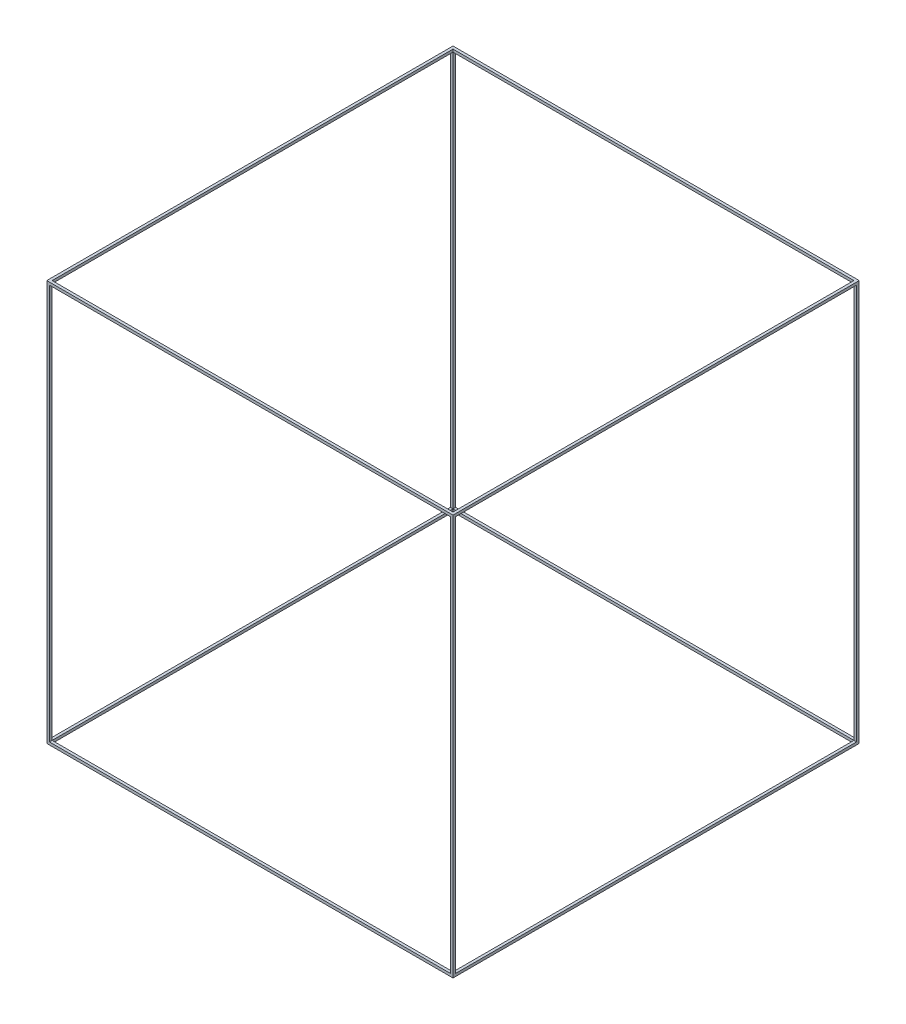
ISO-10303-21;
HEADER;
FILE_DESCRIPTION(('STEP AP214'),'2;1');
FILE_NAME('part.step','',(''),(''),'','','');
FILE_SCHEMA(('AUTOMOTIVE_DESIGN { 1 0 10303 214 1 1 1 1 }'));
ENDSEC;
DATA;
#1=APPLICATION_CONTEXT('core data for automotive mechanical design processes');
#2=APPLICATION_PROTOCOL_DEFINITION('international standard','automotive_design',2000,#1);
#3=PRODUCT_CONTEXT('',#1,'mechanical');
#4=PRODUCT('Part','Part','',(#3));
#5=PRODUCT_RELATED_PRODUCT_CATEGORY('part','',(#4));
#6=PRODUCT_DEFINITION_FORMATION('','',#4);
#7=PRODUCT_DEFINITION_CONTEXT('part definition',#1,'design');
#8=PRODUCT_DEFINITION('design','',#6,#7);
#9=PRODUCT_DEFINITION_SHAPE('','',#8);
#10=(LENGTH_UNIT() NAMED_UNIT(*) SI_UNIT(.MILLI.,.METRE.));
#11=(NAMED_UNIT(*) PLANE_ANGLE_UNIT() SI_UNIT($,.RADIAN.));
#12=(NAMED_UNIT(*) SI_UNIT($,.STERADIAN.) SOLID_ANGLE_UNIT());
#13=UNCERTAINTY_MEASURE_WITH_UNIT(LENGTH_MEASURE(1.E-05),#10,'distance_accuracy_value','');
#14=(GEOMETRIC_REPRESENTATION_CONTEXT(3) GLOBAL_UNCERTAINTY_ASSIGNED_CONTEXT((#13)) GLOBAL_UNIT_ASSIGNED_CONTEXT((#10,
#11,#12)) REPRESENTATION_CONTEXT('',''));
#15=CARTESIAN_POINT('',(0.,0.,0.));
#16=DIRECTION('',(0.,0.,1.));
#17=DIRECTION('',(1.,0.,0.));
#18=AXIS2_PLACEMENT_3D('',#15,#16,#17);
#19=CARTESIAN_POINT('',(-75.,149.,-75.));
#20=DIRECTION('',(1.,0.,0.));
#21=DIRECTION('',(0.,0.,-1.));
#22=AXIS2_PLACEMENT_3D('',#19,#20,#21);
#23=PLANE('',#22);
#24=DIRECTION('',(0.,1.,0.));
#25=VECTOR('',#24,1.);
#26=CARTESIAN_POINT('',(-75.,149.,-75.));
#27=LINE('',#26,#25);
#28=CARTESIAN_POINT('',(-75.,1.,-75.));
#29=VERTEX_POINT('',#28);
#30=CARTESIAN_POINT('',(-75.,149.,-75.));
#31=VERTEX_POINT('',#30);
#32=EDGE_CURVE('E231',#29,#31,#27,.T.);
#33=ORIENTED_EDGE('',*,*,#32,.F.);
#34=DIRECTION('',(0.,0.,1.));
#35=VECTOR('',#34,1.);
#36=CARTESIAN_POINT('',(-75.,1.,-76.));
#37=LINE('',#36,#35);
#38=CARTESIAN_POINT('',(-75.,1.,-76.));
#39=VERTEX_POINT('',#38);
#40=EDGE_CURVE('E276',#39,#29,#37,.T.);
#41=ORIENTED_EDGE('',*,*,#40,.F.);
#42=DIRECTION('',(0.,-1.,0.));
#43=VECTOR('',#42,1.);
#44=CARTESIAN_POINT('',(-75.,149.,-76.));
#45=LINE('',#44,#43);
#46=CARTESIAN_POINT('',(-75.,149.,-76.));
#47=VERTEX_POINT('',#46);
#48=EDGE_CURVE('E240',#47,#39,#45,.T.);
#49=ORIENTED_EDGE('',*,*,#48,.F.);
#50=DIRECTION('',(0.,0.,1.));
#51=VECTOR('',#50,1.);
#52=CARTESIAN_POINT('',(-75.,149.,-76.));
#53=LINE('',#52,#51);
#54=EDGE_CURVE('E263',#47,#31,#53,.T.);
#55=ORIENTED_EDGE('',*,*,#54,.T.);
#56=EDGE_LOOP('',(#33,#41,#49,#55));
#57=FACE_BOUND('',#56,.T.);
#58=ADVANCED_FACE('F41',(#57),#23,.T.);
#59=DIRECTION('',(0.,0.,1.));
#60=VECTOR('',#59,1.);
#61=CARTESIAN_POINT('',(-75.,149.,-75.));
#62=LINE('',#61,#60);
#63=CARTESIAN_POINT('',(-75.,149.,75.));
#64=VERTEX_POINT('',#63);
#65=EDGE_CURVE('E237',#31,#64,#62,.T.);
#66=ORIENTED_EDGE('',*,*,#65,.F.);
#67=DIRECTION('',(0.,-1.,0.));
#68=VECTOR('',#67,1.);
#69=CARTESIAN_POINT('',(-75.,149.,-75.));
#70=LINE('',#69,#68);
#71=CARTESIAN_POINT('',(-75.,150.,-75.));
#72=VERTEX_POINT('',#71);
#73=EDGE_CURVE('E309',#72,#31,#70,.T.);
#74=ORIENTED_EDGE('',*,*,#73,.F.);
#75=DIRECTION('',(0.,0.,1.));
#76=VECTOR('',#75,1.);
#77=CARTESIAN_POINT('',(-75.,150.,-75.));
#78=LINE('',#77,#76);
#79=CARTESIAN_POINT('',(-75.,150.,75.));
#80=VERTEX_POINT('',#79);
#81=EDGE_CURVE('E284',#72,#80,#78,.T.);
#82=ORIENTED_EDGE('',*,*,#81,.T.);
#83=DIRECTION('',(0.,-1.,0.));
#84=VECTOR('',#83,1.);
#85=CARTESIAN_POINT('',(-75.,149.,75.));
#86=LINE('',#85,#84);
#87=EDGE_CURVE('E321',#80,#64,#86,.T.);
#88=ORIENTED_EDGE('',*,*,#87,.T.);
#89=EDGE_LOOP('',(#66,#74,#82,#88));
#90=FACE_BOUND('',#89,.T.);
#91=ADVANCED_FACE('F370',(#90),#23,.T.);
#92=DIRECTION('',(0.,-1.,0.));
#93=VECTOR('',#92,1.);
#94=CARTESIAN_POINT('',(-75.,149.,75.0000000000001));
#95=LINE('',#94,#93);
#96=CARTESIAN_POINT('',(-75.,1.,75.));
#97=VERTEX_POINT('',#96);
#98=EDGE_CURVE('E227',#64,#97,#95,.T.);
#99=ORIENTED_EDGE('',*,*,#98,.F.);
#100=CARTESIAN_POINT('',(-75.,149.,76.));
#101=VERTEX_POINT('',#100);
#102=EDGE_CURVE('E267',#64,#101,#53,.T.);
#103=ORIENTED_EDGE('',*,*,#102,.T.);
#104=DIRECTION('',(0.,-1.,0.));
#105=VECTOR('',#104,1.);
#106=CARTESIAN_POINT('',(-75.,149.,76.));
#107=LINE('',#106,#105);
#108=CARTESIAN_POINT('',(-75.,1.,76.));
#109=VERTEX_POINT('',#108);
#110=EDGE_CURVE('E239',#101,#109,#107,.T.);
#111=ORIENTED_EDGE('',*,*,#110,.T.);
#112=EDGE_CURVE('E253',#97,#109,#37,.T.);
#113=ORIENTED_EDGE('',*,*,#112,.F.);
#114=EDGE_LOOP('',(#99,#103,#111,#113));
#115=FACE_BOUND('',#114,.T.);
#116=ADVANCED_FACE('F385',(#115),#23,.T.);
#117=CARTESIAN_POINT('',(75.,149.,-75.));
#118=DIRECTION('',(-1.,0.,0.));
#119=DIRECTION('',(0.,0.,1.));
#120=AXIS2_PLACEMENT_3D('',#117,#118,#119);
#121=PLANE('',#120);
#122=DIRECTION('',(0.,-1.,0.));
#123=VECTOR('',#122,1.);
#124=CARTESIAN_POINT('',(75.,149.,-75.));
#125=LINE('',#124,#123);
#126=CARTESIAN_POINT('',(75.,149.,-75.));
#127=VERTEX_POINT('',#126);
#128=CARTESIAN_POINT('',(75.,1.,-75.));
#129=VERTEX_POINT('',#128);
#130=EDGE_CURVE('E187',#127,#129,#125,.T.);
#131=ORIENTED_EDGE('',*,*,#130,.F.);
#132=DIRECTION('',(0.,0.,1.));
#133=VECTOR('',#132,1.);
#134=CARTESIAN_POINT('',(75.,149.,-76.));
#135=LINE('',#134,#133);
#136=CARTESIAN_POINT('',(75.,149.,-76.));
#137=VERTEX_POINT('',#136);
#138=EDGE_CURVE('E268',#137,#127,#135,.T.);
#139=ORIENTED_EDGE('',*,*,#138,.F.);
#140=DIRECTION('',(0.,1.,0.));
#141=VECTOR('',#140,1.);
#142=CARTESIAN_POINT('',(75.,149.,-76.));
#143=LINE('',#142,#141);
#144=CARTESIAN_POINT('',(75.,1.,-76.));
#145=VERTEX_POINT('',#144);
#146=EDGE_CURVE('E247',#145,#137,#143,.T.);
#147=ORIENTED_EDGE('',*,*,#146,.F.);
#148=DIRECTION('',(0.,0.,1.));
#149=VECTOR('',#148,1.);
#150=CARTESIAN_POINT('',(75.,1.,-76.));
#151=LINE('',#150,#149);
#152=EDGE_CURVE('E272',#145,#129,#151,.T.);
#153=ORIENTED_EDGE('',*,*,#152,.T.);
#154=EDGE_LOOP('',(#131,#139,#147,#153));
#155=FACE_BOUND('',#154,.T.);
#156=ADVANCED_FACE('F403',(#155),#121,.T.);
#157=DIRECTION('',(0.,0.,-1.));
#158=VECTOR('',#157,1.);
#159=CARTESIAN_POINT('',(75.,149.,-75.));
#160=LINE('',#159,#158);
#161=CARTESIAN_POINT('',(75.,149.,75.));
#162=VERTEX_POINT('',#161);
#163=EDGE_CURVE('E11',#162,#127,#160,.T.);
#164=ORIENTED_EDGE('',*,*,#163,.F.);
#165=DIRECTION('',(0.,-1.,0.));
#166=VECTOR('',#165,1.);
#167=CARTESIAN_POINT('',(75.,149.,75.));
#168=LINE('',#167,#166);
#169=CARTESIAN_POINT('',(75.,150.,75.));
#170=VERTEX_POINT('',#169);
#171=EDGE_CURVE('E317',#170,#162,#168,.T.);
#172=ORIENTED_EDGE('',*,*,#171,.F.);
#173=DIRECTION('',(0.,0.,-1.));
#174=VECTOR('',#173,1.);
#175=CARTESIAN_POINT('',(75.,150.,-75.));
#176=LINE('',#175,#174);
#177=CARTESIAN_POINT('',(75.,150.,-75.));
#178=VERTEX_POINT('',#177);
#179=EDGE_CURVE('E290',#170,#178,#176,.T.);
#180=ORIENTED_EDGE('',*,*,#179,.T.);
#181=DIRECTION('',(0.,-1.,0.));
#182=VECTOR('',#181,1.);
#183=CARTESIAN_POINT('',(75.,149.,-75.));
#184=LINE('',#183,#182);
#185=EDGE_CURVE('E313',#178,#127,#184,.T.);
#186=ORIENTED_EDGE('',*,*,#185,.T.);
#187=EDGE_LOOP('',(#164,#172,#180,#186));
#188=FACE_BOUND('',#187,.T.);
#189=ADVANCED_FACE('F399',(#188),#121,.T.);
#190=DIRECTION('',(0.,1.,0.));
#191=VECTOR('',#190,1.);
#192=CARTESIAN_POINT('',(75.,149.,75.));
#193=LINE('',#192,#191);
#194=CARTESIAN_POINT('',(75.,1.,75.));
#195=VERTEX_POINT('',#194);
#196=EDGE_CURVE('E219',#195,#162,#193,.T.);
#197=ORIENTED_EDGE('',*,*,#196,.F.);
#198=CARTESIAN_POINT('',(75.,1.,76.));
#199=VERTEX_POINT('',#198);
#200=EDGE_CURVE('E275',#195,#199,#151,.T.);
#201=ORIENTED_EDGE('',*,*,#200,.T.);
#202=DIRECTION('',(0.,1.,0.));
#203=VECTOR('',#202,1.);
#204=CARTESIAN_POINT('',(75.,149.,76.));
#205=LINE('',#204,#203);
#206=CARTESIAN_POINT('',(75.,149.,76.));
#207=VERTEX_POINT('',#206);
#208=EDGE_CURVE('E258',#199,#207,#205,.T.);
#209=ORIENTED_EDGE('',*,*,#208,.T.);
#210=EDGE_CURVE('E271',#162,#207,#135,.T.);
#211=ORIENTED_EDGE('',*,*,#210,.F.);
#212=EDGE_LOOP('',(#197,#201,#209,#211));
#213=FACE_BOUND('',#212,.T.);
#214=ADVANCED_FACE('F473',(#213),#121,.T.);
#215=CARTESIAN_POINT('',(-75.,149.,75.));
#216=DIRECTION('',(0.,0.,-1.));
#217=DIRECTION('',(-1.,0.,0.));
#218=AXIS2_PLACEMENT_3D('',#215,#216,#217);
#219=PLANE('',#218);
#220=DIRECTION('',(1.,0.,0.));
#221=VECTOR('',#220,1.);
#222=CARTESIAN_POINT('',(-75.,149.,75.));
#223=LINE('',#222,#221);
#224=EDGE_CURVE('E281',#64,#162,#223,.T.);
#225=ORIENTED_EDGE('',*,*,#224,.F.);
#226=ORIENTED_EDGE('',*,*,#87,.F.);
#227=DIRECTION('',(1.,0.,0.));
#228=VECTOR('',#227,1.);
#229=CARTESIAN_POINT('',(-75.,150.,75.));
#230=LINE('',#229,#228);
#231=EDGE_CURVE('E287',#80,#170,#230,.T.);
#232=ORIENTED_EDGE('',*,*,#231,.T.);
#233=ORIENTED_EDGE('',*,*,#171,.T.);
#234=EDGE_LOOP('',(#225,#226,#232,#233));
#235=FACE_BOUND('',#234,.T.);
#236=ADVANCED_FACE('F395',(#235),#219,.T.);
#237=CARTESIAN_POINT('',(-75.,149.,-75.));
#238=DIRECTION('',(0.,0.,1.));
#239=DIRECTION('',(1.,0.,0.));
#240=AXIS2_PLACEMENT_3D('',#237,#238,#239);
#241=PLANE('',#240);
#242=DIRECTION('',(-1.,0.,0.));
#243=VECTOR('',#242,1.);
#244=CARTESIAN_POINT('',(-75.,149.,-75.));
#245=LINE('',#244,#243);
#246=EDGE_CURVE('E49',#127,#31,#245,.T.);
#247=ORIENTED_EDGE('',*,*,#246,.F.);
#248=ORIENTED_EDGE('',*,*,#185,.F.);
#249=DIRECTION('',(-1.,0.,0.));
#250=VECTOR('',#249,1.);
#251=CARTESIAN_POINT('',(-75.,150.,-75.));
#252=LINE('',#251,#250);
#253=EDGE_CURVE('E293',#178,#72,#252,.T.);
#254=ORIENTED_EDGE('',*,*,#253,.T.);
#255=ORIENTED_EDGE('',*,*,#73,.T.);
#256=EDGE_LOOP('',(#247,#248,#254,#255));
#257=FACE_BOUND('',#256,.T.);
#258=ADVANCED_FACE('F365',(#257),#241,.T.);
#259=CARTESIAN_POINT('',(-76.,150.,-75.));
#260=DIRECTION('',(1.,0.,0.));
#261=DIRECTION('',(0.,0.,-1.));
#262=AXIS2_PLACEMENT_3D('',#259,#260,#261);
#263=PLANE('',#262);
#264=DIRECTION('',(0.,0.,1.));
#265=VECTOR('',#264,1.);
#266=CARTESIAN_POINT('',(-76.,1.,-75.));
#267=LINE('',#266,#265);
#268=CARTESIAN_POINT('',(-76.,1.,-75.));
#269=VERTEX_POINT('',#268);
#270=CARTESIAN_POINT('',(-76.,1.,75.));
#271=VERTEX_POINT('',#270);
#272=EDGE_CURVE('E212',#269,#271,#267,.T.);
#273=ORIENTED_EDGE('',*,*,#272,.F.);
#274=DIRECTION('',(0.,-1.,0.));
#275=VECTOR('',#274,1.);
#276=CARTESIAN_POINT('',(-76.,149.,-75.));
#277=LINE('',#276,#275);
#278=CARTESIAN_POINT('',(-76.,149.,-75.));
#279=VERTEX_POINT('',#278);
#280=EDGE_CURVE('E56',#279,#269,#277,.T.);
#281=ORIENTED_EDGE('',*,*,#280,.F.);
#282=DIRECTION('',(0.,0.,-1.));
#283=VECTOR('',#282,1.);
#284=CARTESIAN_POINT('',(-76.,149.,-75.));
#285=LINE('',#284,#283);
#286=CARTESIAN_POINT('',(-76.,149.,75.));
#287=VERTEX_POINT('',#286);
#288=EDGE_CURVE('E203',#287,#279,#285,.T.);
#289=ORIENTED_EDGE('',*,*,#288,.F.);
#290=DIRECTION('',(0.,1.,0.));
#291=VECTOR('',#290,1.);
#292=CARTESIAN_POINT('',(-76.,149.,75.));
#293=LINE('',#292,#291);
#294=EDGE_CURVE('E206',#271,#287,#293,.T.);
#295=ORIENTED_EDGE('',*,*,#294,.F.);
#296=EDGE_LOOP('',(#273,#281,#289,#295));
#297=FACE_BOUND('',#296,.T.);
#298=DIRECTION('',(0.,0.,1.));
#299=VECTOR('',#298,1.);
#300=CARTESIAN_POINT('',(-76.,0.,-75.));
#301=LINE('',#300,#299);
#302=CARTESIAN_POINT('',(-76.,0.,-76.));
#303=VERTEX_POINT('',#302);
#304=CARTESIAN_POINT('',(-76.,0.,76.));
#305=VERTEX_POINT('',#304);
#306=EDGE_CURVE('E324',#303,#305,#301,.T.);
#307=ORIENTED_EDGE('',*,*,#306,.T.);
#308=DIRECTION('',(0.,-1.,0.));
#309=VECTOR('',#308,1.);
#310=CARTESIAN_POINT('',(-76.,150.,76.));
#311=LINE('',#310,#309);
#312=CARTESIAN_POINT('',(-76.,150.,76.));
#313=VERTEX_POINT('',#312);
#314=EDGE_CURVE('E351',#313,#305,#311,.T.);
#315=ORIENTED_EDGE('',*,*,#314,.F.);
#316=DIRECTION('',(0.,0.,1.));
#317=VECTOR('',#316,1.);
#318=CARTESIAN_POINT('',(-76.,150.,-75.));
#319=LINE('',#318,#317);
#320=CARTESIAN_POINT('',(-76.,150.,-76.));
#321=VERTEX_POINT('',#320);
#322=EDGE_CURVE('E325',#321,#313,#319,.T.);
#323=ORIENTED_EDGE('',*,*,#322,.F.);
#324=DIRECTION('',(0.,-1.,0.));
#325=VECTOR('',#324,1.);
#326=CARTESIAN_POINT('',(-76.,150.,-76.));
#327=LINE('',#326,#325);
#328=EDGE_CURVE('E335',#321,#303,#327,.T.);
#329=ORIENTED_EDGE('',*,*,#328,.T.);
#330=EDGE_LOOP('',(#307,#315,#323,#329));
#331=FACE_BOUND('',#330,.T.);
#332=ADVANCED_FACE('F43',(#297,#331),#263,.F.);
#333=CARTESIAN_POINT('',(-75.,150.,76.));
#334=DIRECTION('',(0.,0.,-1.));
#335=DIRECTION('',(-1.,0.,0.));
#336=AXIS2_PLACEMENT_3D('',#333,#334,#335);
#337=PLANE('',#336);
#338=DIRECTION('',(1.,0.,0.));
#339=VECTOR('',#338,1.);
#340=CARTESIAN_POINT('',(-75.,1.,76.));
#341=LINE('',#340,#339);
#342=EDGE_CURVE('E255',#109,#199,#341,.T.);
#343=ORIENTED_EDGE('',*,*,#342,.F.);
#344=ORIENTED_EDGE('',*,*,#110,.F.);
#345=DIRECTION('',(-1.,0.,0.));
#346=VECTOR('',#345,1.);
#347=CARTESIAN_POINT('',(-75.,149.,76.));
#348=LINE('',#347,#346);
#349=EDGE_CURVE('E244',#207,#101,#348,.T.);
#350=ORIENTED_EDGE('',*,*,#349,.F.);
#351=ORIENTED_EDGE('',*,*,#208,.F.);
#352=EDGE_LOOP('',(#343,#344,#350,#351));
#353=FACE_BOUND('',#352,.T.);
#354=DIRECTION('',(1.,0.,0.));
#355=VECTOR('',#354,1.);
#356=CARTESIAN_POINT('',(-75.,0.,76.));
#357=LINE('',#356,#355);
#358=CARTESIAN_POINT('',(76.,0.,76.));
#359=VERTEX_POINT('',#358);
#360=EDGE_CURVE('E338',#305,#359,#357,.T.);
#361=ORIENTED_EDGE('',*,*,#360,.T.);
#362=DIRECTION('',(0.,-1.,0.));
#363=VECTOR('',#362,1.);
#364=CARTESIAN_POINT('',(76.,150.,76.));
#365=LINE('',#364,#363);
#366=CARTESIAN_POINT('',(76.,150.,76.));
#367=VERTEX_POINT('',#366);
#368=EDGE_CURVE('E348',#367,#359,#365,.T.);
#369=ORIENTED_EDGE('',*,*,#368,.F.);
#370=DIRECTION('',(1.,0.,0.));
#371=VECTOR('',#370,1.);
#372=CARTESIAN_POINT('',(-75.,150.,76.));
#373=LINE('',#372,#371);
#374=EDGE_CURVE('E328',#313,#367,#373,.T.);
#375=ORIENTED_EDGE('',*,*,#374,.F.);
#376=ORIENTED_EDGE('',*,*,#314,.T.);
#377=EDGE_LOOP('',(#361,#369,#375,#376));
#378=FACE_BOUND('',#377,.T.);
#379=ADVANCED_FACE('F437',(#353,#378),#337,.F.);
#380=CARTESIAN_POINT('',(76.,150.,-75.));
#381=DIRECTION('',(-1.,0.,0.));
#382=DIRECTION('',(0.,0.,1.));
#383=AXIS2_PLACEMENT_3D('',#380,#381,#382);
#384=PLANE('',#383);
#385=DIRECTION('',(0.,0.,-1.));
#386=VECTOR('',#385,1.);
#387=CARTESIAN_POINT('',(76.,149.,-75.));
#388=LINE('',#387,#386);
#389=CARTESIAN_POINT('',(76.,149.,75.));
#390=VERTEX_POINT('',#389);
#391=CARTESIAN_POINT('',(76.,149.,-75.));
#392=VERTEX_POINT('',#391);
#393=EDGE_CURVE('E202',#390,#392,#388,.T.);
#394=ORIENTED_EDGE('',*,*,#393,.T.);
#395=DIRECTION('',(0.,-1.,0.));
#396=VECTOR('',#395,1.);
#397=CARTESIAN_POINT('',(76.,149.,-75.));
#398=LINE('',#397,#396);
#399=CARTESIAN_POINT('',(76.,1.,-75.));
#400=VERTEX_POINT('',#399);
#401=EDGE_CURVE('E184',#392,#400,#398,.T.);
#402=ORIENTED_EDGE('',*,*,#401,.T.);
#403=DIRECTION('',(0.,0.,1.));
#404=VECTOR('',#403,1.);
#405=CARTESIAN_POINT('',(76.,1.,-75.));
#406=LINE('',#405,#404);
#407=CARTESIAN_POINT('',(76.,1.,75.));
#408=VERTEX_POINT('',#407);
#409=EDGE_CURVE('E194',#400,#408,#406,.T.);
#410=ORIENTED_EDGE('',*,*,#409,.T.);
#411=DIRECTION('',(0.,1.,0.));
#412=VECTOR('',#411,1.);
#413=CARTESIAN_POINT('',(76.,149.,75.));
#414=LINE('',#413,#412);
#415=EDGE_CURVE('E64',#408,#390,#414,.T.);
#416=ORIENTED_EDGE('',*,*,#415,.T.);
#417=EDGE_LOOP('',(#394,#402,#410,#416));
#418=FACE_BOUND('',#417,.T.);
#419=DIRECTION('',(0.,0.,-1.));
#420=VECTOR('',#419,1.);
#421=CARTESIAN_POINT('',(76.,0.,-75.));
#422=LINE('',#421,#420);
#423=CARTESIAN_POINT('',(76.,0.,-76.));
#424=VERTEX_POINT('',#423);
#425=EDGE_CURVE('E340',#359,#424,#422,.T.);
#426=ORIENTED_EDGE('',*,*,#425,.T.);
#427=DIRECTION('',(0.,-1.,0.));
#428=VECTOR('',#427,1.);
#429=CARTESIAN_POINT('',(76.,150.,-76.));
#430=LINE('',#429,#428);
#431=CARTESIAN_POINT('',(76.,150.,-76.));
#432=VERTEX_POINT('',#431);
#433=EDGE_CURVE('E345',#432,#424,#430,.T.);
#434=ORIENTED_EDGE('',*,*,#433,.F.);
#435=DIRECTION('',(0.,0.,-1.));
#436=VECTOR('',#435,1.);
#437=CARTESIAN_POINT('',(76.,150.,-75.));
#438=LINE('',#437,#436);
#439=EDGE_CURVE('E331',#367,#432,#438,.T.);
#440=ORIENTED_EDGE('',*,*,#439,.F.);
#441=ORIENTED_EDGE('',*,*,#368,.T.);
#442=EDGE_LOOP('',(#426,#434,#440,#441));
#443=FACE_BOUND('',#442,.T.);
#444=ADVANCED_FACE('F199',(#418,#443),#384,.F.);
#445=CARTESIAN_POINT('',(-75.,150.,-76.));
#446=DIRECTION('',(0.,0.,1.));
#447=DIRECTION('',(1.,0.,0.));
#448=AXIS2_PLACEMENT_3D('',#445,#446,#447);
#449=PLANE('',#448);
#450=DIRECTION('',(-1.,0.,0.));
#451=VECTOR('',#450,1.);
#452=CARTESIAN_POINT('',(-75.,149.,-76.));
#453=LINE('',#452,#451);
#454=EDGE_CURVE('E250',#137,#47,#453,.T.);
#455=ORIENTED_EDGE('',*,*,#454,.T.);
#456=ORIENTED_EDGE('',*,*,#48,.T.);
#457=DIRECTION('',(1.,0.,0.));
#458=VECTOR('',#457,1.);
#459=CARTESIAN_POINT('',(-75.,1.,-76.));
#460=LINE('',#459,#458);
#461=EDGE_CURVE('E243',#39,#145,#460,.T.);
#462=ORIENTED_EDGE('',*,*,#461,.T.);
#463=ORIENTED_EDGE('',*,*,#146,.T.);
#464=EDGE_LOOP('',(#455,#456,#462,#463));
#465=FACE_BOUND('',#464,.T.);
#466=DIRECTION('',(-1.,0.,0.));
#467=VECTOR('',#466,1.);
#468=CARTESIAN_POINT('',(-75.,0.,-76.));
#469=LINE('',#468,#467);
#470=EDGE_CURVE('E329',#424,#303,#469,.T.);
#471=ORIENTED_EDGE('',*,*,#470,.T.);
#472=ORIENTED_EDGE('',*,*,#328,.F.);
#473=DIRECTION('',(-1.,0.,0.));
#474=VECTOR('',#473,1.);
#475=CARTESIAN_POINT('',(-75.,150.,-76.));
#476=LINE('',#475,#474);
#477=EDGE_CURVE('E333',#432,#321,#476,.T.);
#478=ORIENTED_EDGE('',*,*,#477,.F.);
#479=ORIENTED_EDGE('',*,*,#433,.T.);
#480=EDGE_LOOP('',(#471,#472,#478,#479));
#481=FACE_BOUND('',#480,.T.);
#482=ADVANCED_FACE('F419',(#465,#481),#449,.F.);
#483=CARTESIAN_POINT('',(0.,150.,0.));
#484=DIRECTION('',(0.,1.,0.));
#485=DIRECTION('',(0.,0.,1.));
#486=AXIS2_PLACEMENT_3D('',#483,#484,#485);
#487=PLANE('',#486);
#488=ORIENTED_EDGE('',*,*,#81,.F.);
#489=ORIENTED_EDGE('',*,*,#253,.F.);
#490=ORIENTED_EDGE('',*,*,#179,.F.);
#491=ORIENTED_EDGE('',*,*,#231,.F.);
#492=EDGE_LOOP('',(#488,#489,#490,#491));
#493=FACE_BOUND('',#492,.T.);
#494=ORIENTED_EDGE('',*,*,#322,.T.);
#495=ORIENTED_EDGE('',*,*,#374,.T.);
#496=ORIENTED_EDGE('',*,*,#439,.T.);
#497=ORIENTED_EDGE('',*,*,#477,.T.);
#498=EDGE_LOOP('',(#494,#495,#496,#497));
#499=FACE_BOUND('',#498,.T.);
#500=ADVANCED_FACE('F422',(#493,#499),#487,.T.);
#501=CARTESIAN_POINT('',(0.,0.,0.));
#502=DIRECTION('',(0.,1.,0.));
#503=DIRECTION('',(0.,0.,1.));
#504=AXIS2_PLACEMENT_3D('',#501,#502,#503);
#505=PLANE('',#504);
#506=DIRECTION('',(-1.,0.,0.));
#507=VECTOR('',#506,1.);
#508=CARTESIAN_POINT('',(0.,0.,-75.));
#509=LINE('',#508,#507);
#510=CARTESIAN_POINT('',(75.,0.,-75.));
#511=VERTEX_POINT('',#510);
#512=CARTESIAN_POINT('',(-75.,0.,-75.));
#513=VERTEX_POINT('',#512);
#514=EDGE_CURVE('E302',#511,#513,#509,.T.);
#515=ORIENTED_EDGE('',*,*,#514,.T.);
#516=DIRECTION('',(0.,0.,1.));
#517=VECTOR('',#516,1.);
#518=CARTESIAN_POINT('',(-75.,0.,0.));
#519=LINE('',#518,#517);
#520=CARTESIAN_POINT('',(-75.,0.,75.));
#521=VERTEX_POINT('',#520);
#522=EDGE_CURVE('E305',#513,#521,#519,.T.);
#523=ORIENTED_EDGE('',*,*,#522,.T.);
#524=DIRECTION('',(1.,0.,0.));
#525=VECTOR('',#524,1.);
#526=CARTESIAN_POINT('',(0.,0.,75.));
#527=LINE('',#526,#525);
#528=CARTESIAN_POINT('',(75.,0.,75.));
#529=VERTEX_POINT('',#528);
#530=EDGE_CURVE('E296',#521,#529,#527,.T.);
#531=ORIENTED_EDGE('',*,*,#530,.T.);
#532=DIRECTION('',(0.,0.,-1.));
#533=VECTOR('',#532,1.);
#534=CARTESIAN_POINT('',(75.,0.,0.));
#535=LINE('',#534,#533);
#536=EDGE_CURVE('E299',#529,#511,#535,.T.);
#537=ORIENTED_EDGE('',*,*,#536,.T.);
#538=EDGE_LOOP('',(#515,#523,#531,#537));
#539=FACE_BOUND('',#538,.T.);
#540=ORIENTED_EDGE('',*,*,#306,.F.);
#541=ORIENTED_EDGE('',*,*,#470,.F.);
#542=ORIENTED_EDGE('',*,*,#425,.F.);
#543=ORIENTED_EDGE('',*,*,#360,.F.);
#544=EDGE_LOOP('',(#540,#541,#542,#543));
#545=FACE_BOUND('',#544,.T.);
#546=ADVANCED_FACE('F434',(#539,#545),#505,.F.);
#547=DIRECTION('',(0.,0.,-1.));
#548=VECTOR('',#547,1.);
#549=CARTESIAN_POINT('',(-75.,1.,-75.));
#550=LINE('',#549,#548);
#551=EDGE_CURVE('E235',#97,#29,#550,.T.);
#552=ORIENTED_EDGE('',*,*,#551,.F.);
#553=EDGE_CURVE('E320',#97,#521,#86,.T.);
#554=ORIENTED_EDGE('',*,*,#553,.T.);
#555=ORIENTED_EDGE('',*,*,#522,.F.);
#556=EDGE_CURVE('E308',#29,#513,#70,.T.);
#557=ORIENTED_EDGE('',*,*,#556,.F.);
#558=EDGE_LOOP('',(#552,#554,#555,#557));
#559=FACE_BOUND('',#558,.T.);
#560=ADVANCED_FACE('F450',(#559),#23,.T.);
#561=DIRECTION('',(-1.,0.,0.));
#562=VECTOR('',#561,1.);
#563=CARTESIAN_POINT('',(-75.,1.,75.));
#564=LINE('',#563,#562);
#565=EDGE_CURVE('E266',#195,#97,#564,.T.);
#566=ORIENTED_EDGE('',*,*,#565,.F.);
#567=EDGE_CURVE('E316',#195,#529,#168,.T.);
#568=ORIENTED_EDGE('',*,*,#567,.T.);
#569=ORIENTED_EDGE('',*,*,#530,.F.);
#570=ORIENTED_EDGE('',*,*,#553,.F.);
#571=EDGE_LOOP('',(#566,#568,#569,#570));
#572=FACE_BOUND('',#571,.T.);
#573=ADVANCED_FACE('F456',(#572),#219,.T.);
#574=DIRECTION('',(0.,0.,1.));
#575=VECTOR('',#574,1.);
#576=CARTESIAN_POINT('',(75.,1.,-75.));
#577=LINE('',#576,#575);
#578=EDGE_CURVE('E233',#129,#195,#577,.T.);
#579=ORIENTED_EDGE('',*,*,#578,.F.);
#580=EDGE_CURVE('E312',#129,#511,#184,.T.);
#581=ORIENTED_EDGE('',*,*,#580,.T.);
#582=ORIENTED_EDGE('',*,*,#536,.F.);
#583=ORIENTED_EDGE('',*,*,#567,.F.);
#584=EDGE_LOOP('',(#579,#581,#582,#583));
#585=FACE_BOUND('',#584,.T.);
#586=ADVANCED_FACE('F415',(#585),#121,.T.);
#587=DIRECTION('',(1.,0.,0.));
#588=VECTOR('',#587,1.);
#589=CARTESIAN_POINT('',(-75.,1.,-75.));
#590=LINE('',#589,#588);
#591=EDGE_CURVE('E354',#29,#129,#590,.T.);
#592=ORIENTED_EDGE('',*,*,#591,.F.);
#593=ORIENTED_EDGE('',*,*,#556,.T.);
#594=ORIENTED_EDGE('',*,*,#514,.F.);
#595=ORIENTED_EDGE('',*,*,#580,.F.);
#596=EDGE_LOOP('',(#592,#593,#594,#595));
#597=FACE_BOUND('',#596,.T.);
#598=ADVANCED_FACE('F411',(#597),#241,.T.);
#599=CARTESIAN_POINT('',(-75.,1.,-76.));
#600=DIRECTION('',(0.,-1.,0.));
#601=DIRECTION('',(0.,0.,-1.));
#602=AXIS2_PLACEMENT_3D('',#599,#600,#601);
#603=PLANE('',#602);
#604=ORIENTED_EDGE('',*,*,#591,.T.);
#605=ORIENTED_EDGE('',*,*,#152,.F.);
#606=ORIENTED_EDGE('',*,*,#461,.F.);
#607=ORIENTED_EDGE('',*,*,#40,.T.);
#608=EDGE_LOOP('',(#604,#605,#606,#607));
#609=FACE_BOUND('',#608,.T.);
#610=ADVANCED_FACE('F417',(#609),#603,.F.);
#611=CARTESIAN_POINT('',(-75.,149.,-76.));
#612=DIRECTION('',(0.,1.,0.));
#613=DIRECTION('',(0.,0.,1.));
#614=AXIS2_PLACEMENT_3D('',#611,#612,#613);
#615=PLANE('',#614);
#616=ORIENTED_EDGE('',*,*,#246,.T.);
#617=ORIENTED_EDGE('',*,*,#54,.F.);
#618=ORIENTED_EDGE('',*,*,#454,.F.);
#619=ORIENTED_EDGE('',*,*,#138,.T.);
#620=EDGE_LOOP('',(#616,#617,#618,#619));
#621=FACE_BOUND('',#620,.T.);
#622=ADVANCED_FACE('F359',(#621),#615,.F.);
#623=ORIENTED_EDGE('',*,*,#224,.T.);
#624=ORIENTED_EDGE('',*,*,#210,.T.);
#625=ORIENTED_EDGE('',*,*,#349,.T.);
#626=ORIENTED_EDGE('',*,*,#102,.F.);
#627=EDGE_LOOP('',(#623,#624,#625,#626));
#628=FACE_BOUND('',#627,.T.);
#629=ADVANCED_FACE('F390',(#628),#615,.F.);
#630=ORIENTED_EDGE('',*,*,#565,.T.);
#631=ORIENTED_EDGE('',*,*,#112,.T.);
#632=ORIENTED_EDGE('',*,*,#342,.T.);
#633=ORIENTED_EDGE('',*,*,#200,.F.);
#634=EDGE_LOOP('',(#630,#631,#632,#633));
#635=FACE_BOUND('',#634,.T.);
#636=ADVANCED_FACE('F488',(#635),#603,.F.);
#637=CARTESIAN_POINT('',(76.,1.,-75.));
#638=DIRECTION('',(0.,-1.,0.));
#639=DIRECTION('',(0.,0.,-1.));
#640=AXIS2_PLACEMENT_3D('',#637,#638,#639);
#641=PLANE('',#640);
#642=ORIENTED_EDGE('',*,*,#578,.T.);
#643=DIRECTION('',(-1.,0.,0.));
#644=VECTOR('',#643,1.);
#645=CARTESIAN_POINT('',(76.,1.,75.));
#646=LINE('',#645,#644);
#647=EDGE_CURVE('E196',#408,#195,#646,.T.);
#648=ORIENTED_EDGE('',*,*,#647,.F.);
#649=ORIENTED_EDGE('',*,*,#409,.F.);
#650=DIRECTION('',(-1.,0.,0.));
#651=VECTOR('',#650,1.);
#652=CARTESIAN_POINT('',(76.,1.,-75.));
#653=LINE('',#652,#651);
#654=EDGE_CURVE('E179',#400,#129,#653,.T.);
#655=ORIENTED_EDGE('',*,*,#654,.T.);
#656=EDGE_LOOP('',(#642,#648,#649,#655));
#657=FACE_BOUND('',#656,.T.);
#658=ADVANCED_FACE('F195',(#657),#641,.F.);
#659=CARTESIAN_POINT('',(76.,149.,75.));
#660=DIRECTION('',(0.,0.,1.));
#661=DIRECTION('',(1.,0.,0.));
#662=AXIS2_PLACEMENT_3D('',#659,#660,#661);
#663=PLANE('',#662);
#664=ORIENTED_EDGE('',*,*,#196,.T.);
#665=DIRECTION('',(-1.,0.,0.));
#666=VECTOR('',#665,1.);
#667=CARTESIAN_POINT('',(76.,149.,75.));
#668=LINE('',#667,#666);
#669=EDGE_CURVE('E221',#390,#162,#668,.T.);
#670=ORIENTED_EDGE('',*,*,#669,.F.);
#671=ORIENTED_EDGE('',*,*,#415,.F.);
#672=ORIENTED_EDGE('',*,*,#647,.T.);
#673=EDGE_LOOP('',(#664,#670,#671,#672));
#674=FACE_BOUND('',#673,.T.);
#675=ADVANCED_FACE('F512',(#674),#663,.F.);
#676=CARTESIAN_POINT('',(76.,149.,-75.));
#677=DIRECTION('',(0.,1.,0.));
#678=DIRECTION('',(0.,0.,1.));
#679=AXIS2_PLACEMENT_3D('',#676,#677,#678);
#680=PLANE('',#679);
#681=ORIENTED_EDGE('',*,*,#163,.T.);
#682=DIRECTION('',(-1.,0.,0.));
#683=VECTOR('',#682,1.);
#684=CARTESIAN_POINT('',(76.,149.,-75.));
#685=LINE('',#684,#683);
#686=EDGE_CURVE('E217',#392,#127,#685,.T.);
#687=ORIENTED_EDGE('',*,*,#686,.F.);
#688=ORIENTED_EDGE('',*,*,#393,.F.);
#689=ORIENTED_EDGE('',*,*,#669,.T.);
#690=EDGE_LOOP('',(#681,#687,#688,#689));
#691=FACE_BOUND('',#690,.T.);
#692=ADVANCED_FACE('F401',(#691),#680,.F.);
#693=CARTESIAN_POINT('',(76.,149.,-75.));
#694=DIRECTION('',(0.,0.,-1.));
#695=DIRECTION('',(0.,1.,0.));
#696=AXIS2_PLACEMENT_3D('',#693,#694,#695);
#697=PLANE('',#696);
#698=ORIENTED_EDGE('',*,*,#130,.T.);
#699=ORIENTED_EDGE('',*,*,#654,.F.);
#700=ORIENTED_EDGE('',*,*,#401,.F.);
#701=ORIENTED_EDGE('',*,*,#686,.T.);
#702=EDGE_LOOP('',(#698,#699,#700,#701));
#703=FACE_BOUND('',#702,.T.);
#704=ADVANCED_FACE('F181',(#703),#697,.F.);
#705=ORIENTED_EDGE('',*,*,#65,.T.);
#706=EDGE_CURVE('E224',#64,#287,#668,.T.);
#707=ORIENTED_EDGE('',*,*,#706,.T.);
#708=ORIENTED_EDGE('',*,*,#288,.T.);
#709=EDGE_CURVE('E220',#31,#279,#685,.T.);
#710=ORIENTED_EDGE('',*,*,#709,.F.);
#711=EDGE_LOOP('',(#705,#707,#708,#710));
#712=FACE_BOUND('',#711,.T.);
#713=ADVANCED_FACE('F375',(#712),#680,.F.);
#714=ORIENTED_EDGE('',*,*,#551,.T.);
#715=EDGE_CURVE('E191',#29,#269,#653,.T.);
#716=ORIENTED_EDGE('',*,*,#715,.T.);
#717=ORIENTED_EDGE('',*,*,#272,.T.);
#718=EDGE_CURVE('E190',#97,#271,#646,.T.);
#719=ORIENTED_EDGE('',*,*,#718,.F.);
#720=EDGE_LOOP('',(#714,#716,#717,#719));
#721=FACE_BOUND('',#720,.T.);
#722=ADVANCED_FACE('F494',(#721),#641,.F.);
#723=ORIENTED_EDGE('',*,*,#32,.T.);
#724=ORIENTED_EDGE('',*,*,#709,.T.);
#725=ORIENTED_EDGE('',*,*,#280,.T.);
#726=ORIENTED_EDGE('',*,*,#715,.F.);
#727=EDGE_LOOP('',(#723,#724,#725,#726));
#728=FACE_BOUND('',#727,.T.);
#729=ADVANCED_FACE('F496',(#728),#697,.F.);
#730=ORIENTED_EDGE('',*,*,#98,.T.);
#731=ORIENTED_EDGE('',*,*,#718,.T.);
#732=ORIENTED_EDGE('',*,*,#294,.T.);
#733=ORIENTED_EDGE('',*,*,#706,.F.);
#734=EDGE_LOOP('',(#730,#731,#732,#733));
#735=FACE_BOUND('',#734,.T.);
#736=ADVANCED_FACE('F378',(#735),#663,.F.);
#737=CLOSED_SHELL('',(#58,#91,#116,#156,#189,#214,#236,#258,#332,#379,#444,#482,#500,#546,#560,
#573,#586,#598,#610,#622,#629,#636,#658,#675,#692,#704,#713,#722,#729,#736));
#738=MANIFOLD_SOLID_BREP('B2',#737);
#739=ADVANCED_BREP_SHAPE_REPRESENTATION('',(#18,#738),#14);
#740=SHAPE_DEFINITION_REPRESENTATION(#9,#739);
ENDSEC;
END-ISO-10303-21;
